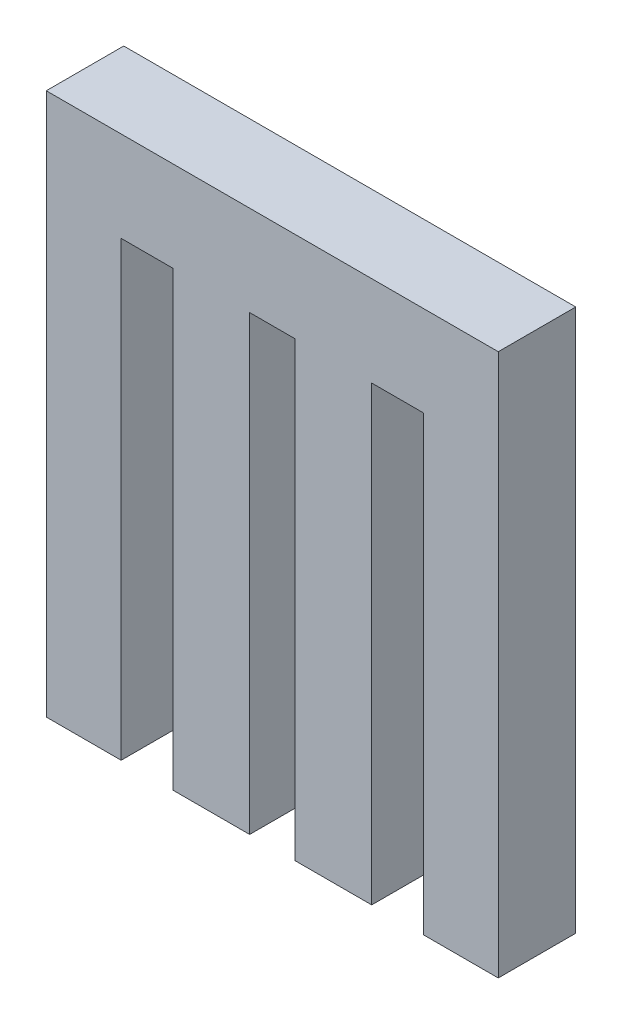
ISO-10303-21;
HEADER;
FILE_DESCRIPTION(('STEP AP214'),'2;1');
FILE_NAME('part.step','',(''),(''),'','','');
FILE_SCHEMA(('AUTOMOTIVE_DESIGN { 1 0 10303 214 1 1 1 1 }'));
ENDSEC;
DATA;
#1=APPLICATION_CONTEXT('core data for automotive mechanical design processes');
#2=APPLICATION_PROTOCOL_DEFINITION('international standard','automotive_design',2000,#1);
#3=PRODUCT_CONTEXT('',#1,'mechanical');
#4=PRODUCT('Part','Part','',(#3));
#5=PRODUCT_RELATED_PRODUCT_CATEGORY('part','',(#4));
#6=PRODUCT_DEFINITION_FORMATION('','',#4);
#7=PRODUCT_DEFINITION_CONTEXT('part definition',#1,'design');
#8=PRODUCT_DEFINITION('design','',#6,#7);
#9=PRODUCT_DEFINITION_SHAPE('','',#8);
#10=(LENGTH_UNIT() NAMED_UNIT(*) SI_UNIT(.MILLI.,.METRE.));
#11=(NAMED_UNIT(*) PLANE_ANGLE_UNIT() SI_UNIT($,.RADIAN.));
#12=(NAMED_UNIT(*) SI_UNIT($,.STERADIAN.) SOLID_ANGLE_UNIT());
#13=UNCERTAINTY_MEASURE_WITH_UNIT(LENGTH_MEASURE(1.E-05),#10,'distance_accuracy_value','');
#14=(GEOMETRIC_REPRESENTATION_CONTEXT(3) GLOBAL_UNCERTAINTY_ASSIGNED_CONTEXT((#13)) GLOBAL_UNIT_ASSIGNED_CONTEXT((#10,
#11,#12)) REPRESENTATION_CONTEXT('',''));
#15=CARTESIAN_POINT('',(0.,0.,0.));
#16=DIRECTION('',(0.,0.,1.));
#17=DIRECTION('',(1.,0.,0.));
#18=AXIS2_PLACEMENT_3D('',#15,#16,#17);
#19=CARTESIAN_POINT('',(17.5,-21.,6.));
#20=DIRECTION('',(0.,1.,0.));
#21=DIRECTION('',(-1.,0.,0.));
#22=AXIS2_PLACEMENT_3D('',#19,#20,#21);
#23=PLANE('',#22);
#24=DIRECTION('',(1.,0.,0.));
#25=VECTOR('',#24,1.);
#26=CARTESIAN_POINT('',(17.5,-21.,6.));
#27=LINE('',#26,#25);
#28=CARTESIAN_POINT('',(1.75,-21.,6.));
#29=VERTEX_POINT('',#28);
#30=CARTESIAN_POINT('',(7.7,-21.,6.));
#31=VERTEX_POINT('',#30);
#32=EDGE_CURVE('E162',#29,#31,#27,.T.);
#33=ORIENTED_EDGE('',*,*,#32,.F.);
#34=DIRECTION('',(0.,0.,-1.));
#35=VECTOR('',#34,1.);
#36=CARTESIAN_POINT('',(1.75,-21.,6.));
#37=LINE('',#36,#35);
#38=CARTESIAN_POINT('',(1.75,-21.,0.));
#39=VERTEX_POINT('',#38);
#40=EDGE_CURVE('E147',#29,#39,#37,.T.);
#41=ORIENTED_EDGE('',*,*,#40,.T.);
#42=DIRECTION('',(1.,0.,0.));
#43=VECTOR('',#42,1.);
#44=CARTESIAN_POINT('',(17.5,-21.,0.));
#45=LINE('',#44,#43);
#46=CARTESIAN_POINT('',(7.7,-21.,0.));
#47=VERTEX_POINT('',#46);
#48=EDGE_CURVE('E200',#39,#47,#45,.T.);
#49=ORIENTED_EDGE('',*,*,#48,.T.);
#50=DIRECTION('',(0.,0.,-1.));
#51=VECTOR('',#50,1.);
#52=CARTESIAN_POINT('',(7.7,-21.,6.));
#53=LINE('',#52,#51);
#54=EDGE_CURVE('E171',#31,#47,#53,.T.);
#55=ORIENTED_EDGE('',*,*,#54,.F.);
#56=EDGE_LOOP('',(#33,#41,#49,#55));
#57=FACE_BOUND('',#56,.T.);
#58=ADVANCED_FACE('F33',(#57),#23,.F.);
#59=CARTESIAN_POINT('',(-17.5,-21.,0.));
#60=VERTEX_POINT('',#59);
#61=CARTESIAN_POINT('',(-11.7,-21.,0.));
#62=VERTEX_POINT('',#61);
#63=EDGE_CURVE('E195',#60,#62,#45,.T.);
#64=ORIENTED_EDGE('',*,*,#63,.T.);
#65=DIRECTION('',(0.,0.,-1.));
#66=VECTOR('',#65,1.);
#67=CARTESIAN_POINT('',(-11.7,-21.,6.));
#68=LINE('',#67,#66);
#69=CARTESIAN_POINT('',(-11.7,-21.,6.));
#70=VERTEX_POINT('',#69);
#71=EDGE_CURVE('E246',#70,#62,#68,.T.);
#72=ORIENTED_EDGE('',*,*,#71,.F.);
#73=CARTESIAN_POINT('',(-17.5,-21.,6.));
#74=VERTEX_POINT('',#73);
#75=EDGE_CURVE('E175',#74,#70,#27,.T.);
#76=ORIENTED_EDGE('',*,*,#75,.F.);
#77=DIRECTION('',(0.,0.,-1.));
#78=VECTOR('',#77,1.);
#79=CARTESIAN_POINT('',(-17.5,-21.,6.));
#80=LINE('',#79,#78);
#81=EDGE_CURVE('E11',#74,#60,#80,.T.);
#82=ORIENTED_EDGE('',*,*,#81,.T.);
#83=EDGE_LOOP('',(#64,#72,#76,#82));
#84=FACE_BOUND('',#83,.T.);
#85=ADVANCED_FACE('F316',(#84),#23,.F.);
#86=CARTESIAN_POINT('',(11.7,-21.,6.));
#87=VERTEX_POINT('',#86);
#88=CARTESIAN_POINT('',(17.5,-21.,6.));
#89=VERTEX_POINT('',#88);
#90=EDGE_CURVE('E173',#87,#89,#27,.T.);
#91=ORIENTED_EDGE('',*,*,#90,.F.);
#92=DIRECTION('',(0.,0.,-1.));
#93=VECTOR('',#92,1.);
#94=CARTESIAN_POINT('',(11.7,-21.,6.));
#95=LINE('',#94,#93);
#96=CARTESIAN_POINT('',(11.7,-21.,0.));
#97=VERTEX_POINT('',#96);
#98=EDGE_CURVE('E229',#87,#97,#95,.T.);
#99=ORIENTED_EDGE('',*,*,#98,.T.);
#100=CARTESIAN_POINT('',(17.5,-21.,0.));
#101=VERTEX_POINT('',#100);
#102=EDGE_CURVE('E193',#97,#101,#45,.T.);
#103=ORIENTED_EDGE('',*,*,#102,.T.);
#104=DIRECTION('',(0.,0.,-1.));
#105=VECTOR('',#104,1.);
#106=CARTESIAN_POINT('',(17.5,-21.,6.));
#107=LINE('',#106,#105);
#108=EDGE_CURVE('E41',#89,#101,#107,.T.);
#109=ORIENTED_EDGE('',*,*,#108,.F.);
#110=EDGE_LOOP('',(#91,#99,#103,#109));
#111=FACE_BOUND('',#110,.T.);
#112=ADVANCED_FACE('F293',(#111),#23,.F.);
#113=CARTESIAN_POINT('',(-17.5,-21.,6.));
#114=DIRECTION('',(1.,0.,0.));
#115=DIRECTION('',(0.,0.,-1.));
#116=AXIS2_PLACEMENT_3D('',#113,#114,#115);
#117=PLANE('',#116);
#118=DIRECTION('',(0.,-1.,0.));
#119=VECTOR('',#118,1.);
#120=CARTESIAN_POINT('',(-17.5,-21.,0.));
#121=LINE('',#120,#119);
#122=CARTESIAN_POINT('',(-17.5,21.,0.));
#123=VERTEX_POINT('',#122);
#124=EDGE_CURVE('E190',#123,#60,#121,.T.);
#125=ORIENTED_EDGE('',*,*,#124,.T.);
#126=ORIENTED_EDGE('',*,*,#81,.F.);
#127=DIRECTION('',(0.,-1.,0.));
#128=VECTOR('',#127,1.);
#129=CARTESIAN_POINT('',(-17.5,-21.,6.));
#130=LINE('',#129,#128);
#131=CARTESIAN_POINT('',(-17.5,21.,6.));
#132=VERTEX_POINT('',#131);
#133=EDGE_CURVE('E177',#132,#74,#130,.T.);
#134=ORIENTED_EDGE('',*,*,#133,.F.);
#135=DIRECTION('',(0.,0.,-1.));
#136=VECTOR('',#135,1.);
#137=CARTESIAN_POINT('',(-17.5,21.,6.));
#138=LINE('',#137,#136);
#139=EDGE_CURVE('E187',#132,#123,#138,.T.);
#140=ORIENTED_EDGE('',*,*,#139,.T.);
#141=EDGE_LOOP('',(#125,#126,#134,#140));
#142=FACE_BOUND('',#141,.T.);
#143=ADVANCED_FACE('F35',(#142),#117,.F.);
#144=CARTESIAN_POINT('',(-7.7,-21.,0.));
#145=VERTEX_POINT('',#144);
#146=CARTESIAN_POINT('',(-1.75,-21.,0.));
#147=VERTEX_POINT('',#146);
#148=EDGE_CURVE('E199',#145,#147,#45,.T.);
#149=ORIENTED_EDGE('',*,*,#148,.T.);
#150=DIRECTION('',(0.,0.,-1.));
#151=VECTOR('',#150,1.);
#152=CARTESIAN_POINT('',(-1.75,-21.,6.));
#153=LINE('',#152,#151);
#154=CARTESIAN_POINT('',(-1.75,-21.,6.));
#155=VERTEX_POINT('',#154);
#156=EDGE_CURVE('E48',#155,#147,#153,.T.);
#157=ORIENTED_EDGE('',*,*,#156,.F.);
#158=CARTESIAN_POINT('',(-7.7,-21.,6.));
#159=VERTEX_POINT('',#158);
#160=EDGE_CURVE('E172',#159,#155,#27,.T.);
#161=ORIENTED_EDGE('',*,*,#160,.F.);
#162=DIRECTION('',(0.,0.,-1.));
#163=VECTOR('',#162,1.);
#164=CARTESIAN_POINT('',(-7.7,-21.,6.));
#165=LINE('',#164,#163);
#166=EDGE_CURVE('E258',#159,#145,#165,.T.);
#167=ORIENTED_EDGE('',*,*,#166,.T.);
#168=EDGE_LOOP('',(#149,#157,#161,#167));
#169=FACE_BOUND('',#168,.T.);
#170=ADVANCED_FACE('F290',(#169),#23,.F.);
#171=CARTESIAN_POINT('',(17.5,-21.,6.));
#172=DIRECTION('',(-1.,0.,0.));
#173=DIRECTION('',(0.,0.,1.));
#174=AXIS2_PLACEMENT_3D('',#171,#172,#173);
#175=PLANE('',#174);
#176=DIRECTION('',(0.,1.,0.));
#177=VECTOR('',#176,1.);
#178=CARTESIAN_POINT('',(17.5,-21.,0.));
#179=LINE('',#178,#177);
#180=CARTESIAN_POINT('',(17.5,21.,0.));
#181=VERTEX_POINT('',#180);
#182=EDGE_CURVE('E198',#101,#181,#179,.T.);
#183=ORIENTED_EDGE('',*,*,#182,.T.);
#184=DIRECTION('',(0.,0.,-1.));
#185=VECTOR('',#184,1.);
#186=CARTESIAN_POINT('',(17.5,21.,6.));
#187=LINE('',#186,#185);
#188=CARTESIAN_POINT('',(17.5,21.,6.));
#189=VERTEX_POINT('',#188);
#190=EDGE_CURVE('E206',#189,#181,#187,.T.);
#191=ORIENTED_EDGE('',*,*,#190,.F.);
#192=DIRECTION('',(0.,1.,0.));
#193=VECTOR('',#192,1.);
#194=CARTESIAN_POINT('',(17.5,-21.,6.));
#195=LINE('',#194,#193);
#196=EDGE_CURVE('E181',#89,#189,#195,.T.);
#197=ORIENTED_EDGE('',*,*,#196,.F.);
#198=ORIENTED_EDGE('',*,*,#108,.T.);
#199=EDGE_LOOP('',(#183,#191,#197,#198));
#200=FACE_BOUND('',#199,.T.);
#201=ADVANCED_FACE('F212',(#200),#175,.F.);
#202=CARTESIAN_POINT('',(17.5,21.,6.));
#203=DIRECTION('',(0.,-1.,0.));
#204=DIRECTION('',(1.,0.,0.));
#205=AXIS2_PLACEMENT_3D('',#202,#203,#204);
#206=PLANE('',#205);
#207=DIRECTION('',(-1.,0.,0.));
#208=VECTOR('',#207,1.);
#209=CARTESIAN_POINT('',(17.5,21.,0.));
#210=LINE('',#209,#208);
#211=EDGE_CURVE('E202',#181,#123,#210,.T.);
#212=ORIENTED_EDGE('',*,*,#211,.T.);
#213=ORIENTED_EDGE('',*,*,#139,.F.);
#214=DIRECTION('',(-1.,0.,0.));
#215=VECTOR('',#214,1.);
#216=CARTESIAN_POINT('',(17.5,21.,6.));
#217=LINE('',#216,#215);
#218=EDGE_CURVE('E184',#189,#132,#217,.T.);
#219=ORIENTED_EDGE('',*,*,#218,.F.);
#220=ORIENTED_EDGE('',*,*,#190,.T.);
#221=EDGE_LOOP('',(#212,#213,#219,#220));
#222=FACE_BOUND('',#221,.T.);
#223=ADVANCED_FACE('F223',(#222),#206,.F.);
#224=CARTESIAN_POINT('',(0.,0.,6.));
#225=DIRECTION('',(0.,0.,1.));
#226=DIRECTION('',(1.,0.,0.));
#227=AXIS2_PLACEMENT_3D('',#224,#225,#226);
#228=PLANE('',#227);
#229=DIRECTION('',(0.,-1.,0.));
#230=VECTOR('',#229,1.);
#231=CARTESIAN_POINT('',(1.75,-21.,6.));
#232=LINE('',#231,#230);
#233=CARTESIAN_POINT('',(1.75,14.,6.));
#234=VERTEX_POINT('',#233);
#235=EDGE_CURVE('E150',#234,#29,#232,.T.);
#236=ORIENTED_EDGE('',*,*,#235,.T.);
#237=ORIENTED_EDGE('',*,*,#32,.T.);
#238=DIRECTION('',(0.,1.,0.));
#239=VECTOR('',#238,1.);
#240=CARTESIAN_POINT('',(7.7,-21.,6.));
#241=LINE('',#240,#239);
#242=CARTESIAN_POINT('',(7.7,14.,6.));
#243=VERTEX_POINT('',#242);
#244=EDGE_CURVE('E249',#31,#243,#241,.T.);
#245=ORIENTED_EDGE('',*,*,#244,.T.);
#246=DIRECTION('',(1.,0.,0.));
#247=VECTOR('',#246,1.);
#248=CARTESIAN_POINT('',(11.7,14.,6.));
#249=LINE('',#248,#247);
#250=CARTESIAN_POINT('',(11.7,14.,6.));
#251=VERTEX_POINT('',#250);
#252=EDGE_CURVE('E232',#243,#251,#249,.T.);
#253=ORIENTED_EDGE('',*,*,#252,.T.);
#254=DIRECTION('',(0.,-1.,0.));
#255=VECTOR('',#254,1.);
#256=CARTESIAN_POINT('',(11.7,-21.,6.));
#257=LINE('',#256,#255);
#258=EDGE_CURVE('E240',#251,#87,#257,.T.);
#259=ORIENTED_EDGE('',*,*,#258,.T.);
#260=ORIENTED_EDGE('',*,*,#90,.T.);
#261=ORIENTED_EDGE('',*,*,#196,.T.);
#262=ORIENTED_EDGE('',*,*,#218,.T.);
#263=ORIENTED_EDGE('',*,*,#133,.T.);
#264=ORIENTED_EDGE('',*,*,#75,.T.);
#265=DIRECTION('',(0.,1.,0.));
#266=VECTOR('',#265,1.);
#267=CARTESIAN_POINT('',(-11.7,-21.,6.));
#268=LINE('',#267,#266);
#269=CARTESIAN_POINT('',(-11.7,14.,6.));
#270=VERTEX_POINT('',#269);
#271=EDGE_CURVE('E264',#70,#270,#268,.T.);
#272=ORIENTED_EDGE('',*,*,#271,.T.);
#273=DIRECTION('',(1.,0.,0.));
#274=VECTOR('',#273,1.);
#275=CARTESIAN_POINT('',(-11.7,14.,6.));
#276=LINE('',#275,#274);
#277=CARTESIAN_POINT('',(-7.7,14.,6.));
#278=VERTEX_POINT('',#277);
#279=EDGE_CURVE('E272',#270,#278,#276,.T.);
#280=ORIENTED_EDGE('',*,*,#279,.T.);
#281=DIRECTION('',(0.,-1.,0.));
#282=VECTOR('',#281,1.);
#283=CARTESIAN_POINT('',(-7.7,-21.,6.));
#284=LINE('',#283,#282);
#285=EDGE_CURVE('E256',#278,#159,#284,.T.);
#286=ORIENTED_EDGE('',*,*,#285,.T.);
#287=ORIENTED_EDGE('',*,*,#160,.T.);
#288=DIRECTION('',(0.,1.,0.));
#289=VECTOR('',#288,1.);
#290=CARTESIAN_POINT('',(-1.75,-21.,6.));
#291=LINE('',#290,#289);
#292=CARTESIAN_POINT('',(-1.75,14.,6.));
#293=VERTEX_POINT('',#292);
#294=EDGE_CURVE('E166',#155,#293,#291,.T.);
#295=ORIENTED_EDGE('',*,*,#294,.T.);
#296=DIRECTION('',(1.,0.,0.));
#297=VECTOR('',#296,1.);
#298=CARTESIAN_POINT('',(1.75,14.,6.));
#299=LINE('',#298,#297);
#300=EDGE_CURVE('E157',#293,#234,#299,.T.);
#301=ORIENTED_EDGE('',*,*,#300,.T.);
#302=EDGE_LOOP('',(#236,#237,#245,#253,#259,#260,#261,#262,#263,#264,#272,#280,#286,#287,#295,#301));
#303=FACE_BOUND('',#302,.T.);
#304=ADVANCED_FACE('F160',(#303),#228,.T.);
#305=CARTESIAN_POINT('',(0.,0.,0.));
#306=DIRECTION('',(0.,0.,1.));
#307=DIRECTION('',(1.,0.,0.));
#308=AXIS2_PLACEMENT_3D('',#305,#306,#307);
#309=PLANE('',#308);
#310=ORIENTED_EDGE('',*,*,#48,.F.);
#311=DIRECTION('',(0.,-1.,0.));
#312=VECTOR('',#311,1.);
#313=CARTESIAN_POINT('',(1.75,-21.,0.));
#314=LINE('',#313,#312);
#315=CARTESIAN_POINT('',(1.75,14.,0.));
#316=VERTEX_POINT('',#315);
#317=EDGE_CURVE('E153',#316,#39,#314,.T.);
#318=ORIENTED_EDGE('',*,*,#317,.F.);
#319=DIRECTION('',(1.,0.,0.));
#320=VECTOR('',#319,1.);
#321=CARTESIAN_POINT('',(1.75,14.,0.));
#322=LINE('',#321,#320);
#323=CARTESIAN_POINT('',(-1.75,14.,0.));
#324=VERTEX_POINT('',#323);
#325=EDGE_CURVE('E167',#324,#316,#322,.T.);
#326=ORIENTED_EDGE('',*,*,#325,.F.);
#327=DIRECTION('',(0.,1.,0.));
#328=VECTOR('',#327,1.);
#329=CARTESIAN_POINT('',(-1.75,-21.,0.));
#330=LINE('',#329,#328);
#331=EDGE_CURVE('E282',#147,#324,#330,.T.);
#332=ORIENTED_EDGE('',*,*,#331,.F.);
#333=ORIENTED_EDGE('',*,*,#148,.F.);
#334=DIRECTION('',(0.,-1.,0.));
#335=VECTOR('',#334,1.);
#336=CARTESIAN_POINT('',(-7.7,-21.,0.));
#337=LINE('',#336,#335);
#338=CARTESIAN_POINT('',(-7.7,14.,0.));
#339=VERTEX_POINT('',#338);
#340=EDGE_CURVE('E262',#339,#145,#337,.T.);
#341=ORIENTED_EDGE('',*,*,#340,.F.);
#342=DIRECTION('',(1.,0.,0.));
#343=VECTOR('',#342,1.);
#344=CARTESIAN_POINT('',(-11.7,14.,0.));
#345=LINE('',#344,#343);
#346=CARTESIAN_POINT('',(-11.7,14.,0.));
#347=VERTEX_POINT('',#346);
#348=EDGE_CURVE('E265',#347,#339,#345,.T.);
#349=ORIENTED_EDGE('',*,*,#348,.F.);
#350=DIRECTION('',(0.,1.,0.));
#351=VECTOR('',#350,1.);
#352=CARTESIAN_POINT('',(-11.7,-21.,0.));
#353=LINE('',#352,#351);
#354=EDGE_CURVE('E56',#62,#347,#353,.T.);
#355=ORIENTED_EDGE('',*,*,#354,.F.);
#356=ORIENTED_EDGE('',*,*,#63,.F.);
#357=ORIENTED_EDGE('',*,*,#124,.F.);
#358=ORIENTED_EDGE('',*,*,#211,.F.);
#359=ORIENTED_EDGE('',*,*,#182,.F.);
#360=ORIENTED_EDGE('',*,*,#102,.F.);
#361=DIRECTION('',(0.,-1.,0.));
#362=VECTOR('',#361,1.);
#363=CARTESIAN_POINT('',(11.7,-21.,0.));
#364=LINE('',#363,#362);
#365=CARTESIAN_POINT('',(11.7,14.,0.));
#366=VERTEX_POINT('',#365);
#367=EDGE_CURVE('E244',#366,#97,#364,.T.);
#368=ORIENTED_EDGE('',*,*,#367,.F.);
#369=DIRECTION('',(1.,0.,0.));
#370=VECTOR('',#369,1.);
#371=CARTESIAN_POINT('',(11.7,14.,0.));
#372=LINE('',#371,#370);
#373=CARTESIAN_POINT('',(7.7,14.,0.));
#374=VERTEX_POINT('',#373);
#375=EDGE_CURVE('E237',#374,#366,#372,.T.);
#376=ORIENTED_EDGE('',*,*,#375,.F.);
#377=DIRECTION('',(0.,1.,0.));
#378=VECTOR('',#377,1.);
#379=CARTESIAN_POINT('',(7.7,-21.,0.));
#380=LINE('',#379,#378);
#381=EDGE_CURVE('E241',#47,#374,#380,.T.);
#382=ORIENTED_EDGE('',*,*,#381,.F.);
#383=EDGE_LOOP('',(#310,#318,#326,#332,#333,#341,#349,#355,#356,#357,#358,#359,#360,#368,#376,#382));
#384=FACE_BOUND('',#383,.T.);
#385=ADVANCED_FACE('F218',(#384),#309,.F.);
#386=CARTESIAN_POINT('',(11.7,-21.,6.));
#387=DIRECTION('',(1.,0.,0.));
#388=DIRECTION('',(0.,0.,-1.));
#389=AXIS2_PLACEMENT_3D('',#386,#387,#388);
#390=PLANE('',#389);
#391=ORIENTED_EDGE('',*,*,#367,.T.);
#392=ORIENTED_EDGE('',*,*,#98,.F.);
#393=ORIENTED_EDGE('',*,*,#258,.F.);
#394=DIRECTION('',(0.,0.,-1.));
#395=VECTOR('',#394,1.);
#396=CARTESIAN_POINT('',(11.7,14.,6.));
#397=LINE('',#396,#395);
#398=EDGE_CURVE('E194',#251,#366,#397,.T.);
#399=ORIENTED_EDGE('',*,*,#398,.T.);
#400=EDGE_LOOP('',(#391,#392,#393,#399));
#401=FACE_BOUND('',#400,.T.);
#402=ADVANCED_FACE('F296',(#401),#390,.F.);
#403=CARTESIAN_POINT('',(11.7,14.,6.));
#404=DIRECTION('',(0.,1.,0.));
#405=DIRECTION('',(0.,0.,1.));
#406=AXIS2_PLACEMENT_3D('',#403,#404,#405);
#407=PLANE('',#406);
#408=ORIENTED_EDGE('',*,*,#375,.T.);
#409=ORIENTED_EDGE('',*,*,#398,.F.);
#410=ORIENTED_EDGE('',*,*,#252,.F.);
#411=DIRECTION('',(0.,0.,-1.));
#412=VECTOR('',#411,1.);
#413=CARTESIAN_POINT('',(7.7,14.,6.));
#414=LINE('',#413,#412);
#415=EDGE_CURVE('E234',#243,#374,#414,.T.);
#416=ORIENTED_EDGE('',*,*,#415,.T.);
#417=EDGE_LOOP('',(#408,#409,#410,#416));
#418=FACE_BOUND('',#417,.T.);
#419=ADVANCED_FACE('F299',(#418),#407,.F.);
#420=CARTESIAN_POINT('',(7.7,-21.,6.));
#421=DIRECTION('',(-1.,0.,0.));
#422=DIRECTION('',(0.,0.,1.));
#423=AXIS2_PLACEMENT_3D('',#420,#421,#422);
#424=PLANE('',#423);
#425=ORIENTED_EDGE('',*,*,#381,.T.);
#426=ORIENTED_EDGE('',*,*,#415,.F.);
#427=ORIENTED_EDGE('',*,*,#244,.F.);
#428=ORIENTED_EDGE('',*,*,#54,.T.);
#429=EDGE_LOOP('',(#425,#426,#427,#428));
#430=FACE_BOUND('',#429,.T.);
#431=ADVANCED_FACE('F303',(#430),#424,.F.);
#432=CARTESIAN_POINT('',(-11.7,-21.,6.));
#433=DIRECTION('',(-1.,0.,0.));
#434=DIRECTION('',(0.,-1.,0.));
#435=AXIS2_PLACEMENT_3D('',#432,#433,#434);
#436=PLANE('',#435);
#437=ORIENTED_EDGE('',*,*,#354,.T.);
#438=DIRECTION('',(0.,0.,-1.));
#439=VECTOR('',#438,1.);
#440=CARTESIAN_POINT('',(-11.7,14.,6.));
#441=LINE('',#440,#439);
#442=EDGE_CURVE('E253',#270,#347,#441,.T.);
#443=ORIENTED_EDGE('',*,*,#442,.F.);
#444=ORIENTED_EDGE('',*,*,#271,.F.);
#445=ORIENTED_EDGE('',*,*,#71,.T.);
#446=EDGE_LOOP('',(#437,#443,#444,#445));
#447=FACE_BOUND('',#446,.T.);
#448=ADVANCED_FACE('F305',(#447),#436,.F.);
#449=CARTESIAN_POINT('',(-7.7,-21.,6.));
#450=DIRECTION('',(1.,0.,0.));
#451=DIRECTION('',(0.,0.,-1.));
#452=AXIS2_PLACEMENT_3D('',#449,#450,#451);
#453=PLANE('',#452);
#454=ORIENTED_EDGE('',*,*,#340,.T.);
#455=ORIENTED_EDGE('',*,*,#166,.F.);
#456=ORIENTED_EDGE('',*,*,#285,.F.);
#457=DIRECTION('',(0.,0.,-1.));
#458=VECTOR('',#457,1.);
#459=CARTESIAN_POINT('',(-7.7,14.,6.));
#460=LINE('',#459,#458);
#461=EDGE_CURVE('E255',#278,#339,#460,.T.);
#462=ORIENTED_EDGE('',*,*,#461,.T.);
#463=EDGE_LOOP('',(#454,#455,#456,#462));
#464=FACE_BOUND('',#463,.T.);
#465=ADVANCED_FACE('F311',(#464),#453,.F.);
#466=CARTESIAN_POINT('',(-11.7,14.,6.));
#467=DIRECTION('',(0.,1.,0.));
#468=DIRECTION('',(-1.,0.,0.));
#469=AXIS2_PLACEMENT_3D('',#466,#467,#468);
#470=PLANE('',#469);
#471=ORIENTED_EDGE('',*,*,#348,.T.);
#472=ORIENTED_EDGE('',*,*,#461,.F.);
#473=ORIENTED_EDGE('',*,*,#279,.F.);
#474=ORIENTED_EDGE('',*,*,#442,.T.);
#475=EDGE_LOOP('',(#471,#472,#473,#474));
#476=FACE_BOUND('',#475,.T.);
#477=ADVANCED_FACE('F410',(#476),#470,.F.);
#478=CARTESIAN_POINT('',(1.75,-21.,6.));
#479=DIRECTION('',(1.,0.,0.));
#480=DIRECTION('',(0.,1.,0.));
#481=AXIS2_PLACEMENT_3D('',#478,#479,#480);
#482=PLANE('',#481);
#483=ORIENTED_EDGE('',*,*,#317,.T.);
#484=ORIENTED_EDGE('',*,*,#40,.F.);
#485=ORIENTED_EDGE('',*,*,#235,.F.);
#486=DIRECTION('',(0.,0.,-1.));
#487=VECTOR('',#486,1.);
#488=CARTESIAN_POINT('',(1.75,14.,6.));
#489=LINE('',#488,#487);
#490=EDGE_CURVE('E269',#234,#316,#489,.T.);
#491=ORIENTED_EDGE('',*,*,#490,.T.);
#492=EDGE_LOOP('',(#483,#484,#485,#491));
#493=FACE_BOUND('',#492,.T.);
#494=ADVANCED_FACE('F149',(#493),#482,.F.);
#495=CARTESIAN_POINT('',(1.75,14.,6.));
#496=DIRECTION('',(0.,1.,0.));
#497=DIRECTION('',(0.,0.,1.));
#498=AXIS2_PLACEMENT_3D('',#495,#496,#497);
#499=PLANE('',#498);
#500=ORIENTED_EDGE('',*,*,#325,.T.);
#501=ORIENTED_EDGE('',*,*,#490,.F.);
#502=ORIENTED_EDGE('',*,*,#300,.F.);
#503=DIRECTION('',(0.,0.,-1.));
#504=VECTOR('',#503,1.);
#505=CARTESIAN_POINT('',(-1.75,14.,6.));
#506=LINE('',#505,#504);
#507=EDGE_CURVE('E277',#293,#324,#506,.T.);
#508=ORIENTED_EDGE('',*,*,#507,.T.);
#509=EDGE_LOOP('',(#500,#501,#502,#508));
#510=FACE_BOUND('',#509,.T.);
#511=ADVANCED_FACE('F429',(#510),#499,.F.);
#512=CARTESIAN_POINT('',(-1.75,-21.,6.));
#513=DIRECTION('',(-1.,0.,0.));
#514=DIRECTION('',(0.,0.,1.));
#515=AXIS2_PLACEMENT_3D('',#512,#513,#514);
#516=PLANE('',#515);
#517=ORIENTED_EDGE('',*,*,#331,.T.);
#518=ORIENTED_EDGE('',*,*,#507,.F.);
#519=ORIENTED_EDGE('',*,*,#294,.F.);
#520=ORIENTED_EDGE('',*,*,#156,.T.);
#521=EDGE_LOOP('',(#517,#518,#519,#520));
#522=FACE_BOUND('',#521,.T.);
#523=ADVANCED_FACE('F287',(#522),#516,.F.);
#524=CLOSED_SHELL('',(#58,#85,#112,#143,#170,#201,#223,#304,#385,#402,#419,#431,#448,#465,#477,
#494,#511,#523));
#525=MANIFOLD_SOLID_BREP('B2',#524);
#526=ADVANCED_BREP_SHAPE_REPRESENTATION('',(#18,#525),#14);
#527=SHAPE_DEFINITION_REPRESENTATION(#9,#526);
ENDSEC;
END-ISO-10303-21;
